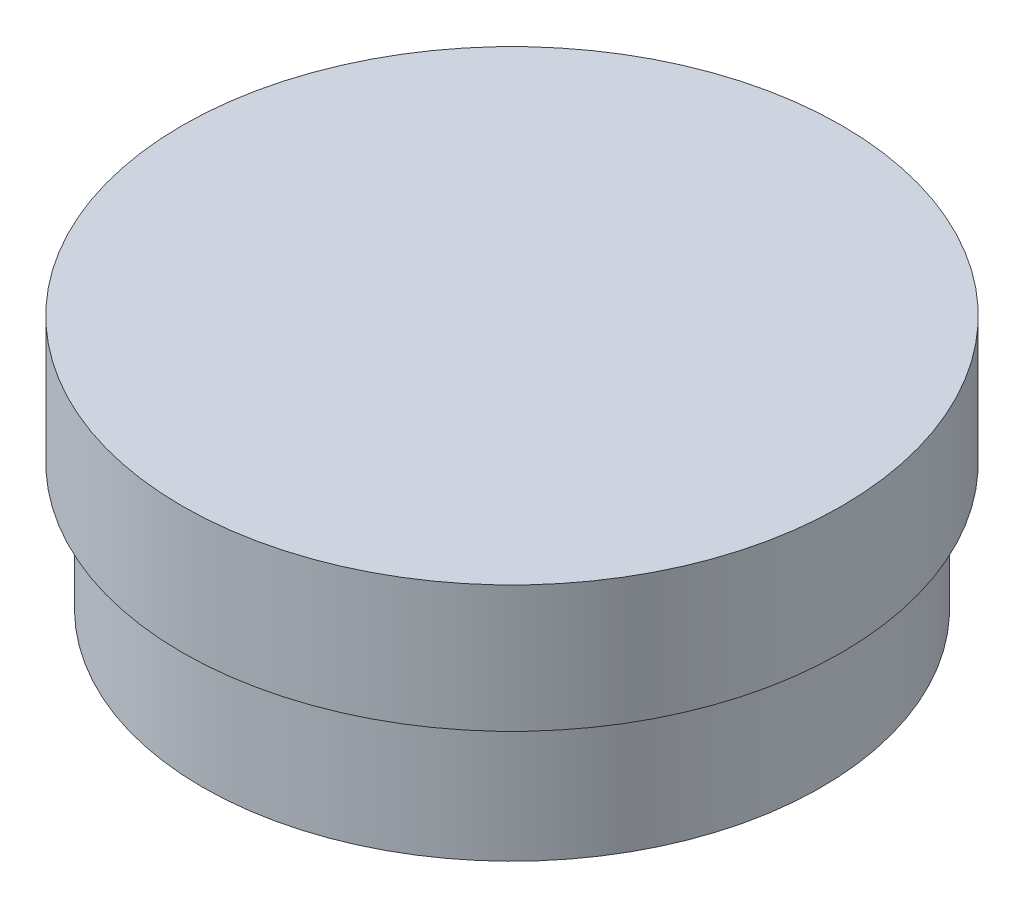
ISO-10303-21;
HEADER;
FILE_DESCRIPTION(('STEP AP214'),'2;1');
FILE_NAME('part.step','',(''),(''),'','','');
FILE_SCHEMA(('AUTOMOTIVE_DESIGN { 1 0 10303 214 1 1 1 1 }'));
ENDSEC;
DATA;
#1=APPLICATION_CONTEXT('core data for automotive mechanical design processes');
#2=APPLICATION_PROTOCOL_DEFINITION('international standard','automotive_design',2000,#1);
#3=PRODUCT_CONTEXT('',#1,'mechanical');
#4=PRODUCT('Part','Part','',(#3));
#5=PRODUCT_RELATED_PRODUCT_CATEGORY('part','',(#4));
#6=PRODUCT_DEFINITION_FORMATION('','',#4);
#7=PRODUCT_DEFINITION_CONTEXT('part definition',#1,'design');
#8=PRODUCT_DEFINITION('design','',#6,#7);
#9=PRODUCT_DEFINITION_SHAPE('','',#8);
#10=(LENGTH_UNIT() NAMED_UNIT(*) SI_UNIT(.MILLI.,.METRE.));
#11=(NAMED_UNIT(*) PLANE_ANGLE_UNIT() SI_UNIT($,.RADIAN.));
#12=(NAMED_UNIT(*) SI_UNIT($,.STERADIAN.) SOLID_ANGLE_UNIT());
#13=UNCERTAINTY_MEASURE_WITH_UNIT(LENGTH_MEASURE(1.E-05),#10,'distance_accuracy_value','');
#14=(GEOMETRIC_REPRESENTATION_CONTEXT(3) GLOBAL_UNCERTAINTY_ASSIGNED_CONTEXT((#13)) GLOBAL_UNIT_ASSIGNED_CONTEXT((#10,
#11,#12)) REPRESENTATION_CONTEXT('',''));
#15=CARTESIAN_POINT('',(0.,0.,0.));
#16=DIRECTION('',(0.,0.,1.));
#17=DIRECTION('',(1.,0.,0.));
#18=AXIS2_PLACEMENT_3D('',#15,#16,#17);
#19=CARTESIAN_POINT('',(0.,48.0535714285714,0.));
#20=DIRECTION('',(0.,-1.,0.));
#21=DIRECTION('',(0.,0.,-1.));
#22=AXIS2_PLACEMENT_3D('',#19,#20,#21);
#23=PLANE('',#22);
#24=CARTESIAN_POINT('',(0.,48.0535714285714,0.));
#25=DIRECTION('',(0.,1.,0.));
#26=DIRECTION('',(0.,0.,1.));
#27=AXIS2_PLACEMENT_3D('',#24,#25,#26);
#28=CIRCLE('',#27,65.);
#29=CARTESIAN_POINT('',(0.,48.0535714285714,65.));
#30=VERTEX_POINT('',#29);
#31=EDGE_CURVE('E10',#30,#30,#28,.T.);
#32=ORIENTED_EDGE('',*,*,#31,.T.);
#33=EDGE_LOOP('',(#32));
#34=FACE_BOUND('',#33,.T.);
#35=ADVANCED_FACE('F37',(#34),#23,.F.);
#36=CARTESIAN_POINT('',(0.,53.1607142857143,0.));
#37=DIRECTION('',(0.,1.,0.));
#38=DIRECTION('',(0.,0.,1.));
#39=AXIS2_PLACEMENT_3D('',#36,#37,#38);
#40=CYLINDRICAL_SURFACE('',#39,65.);
#41=ORIENTED_EDGE('',*,*,#31,.F.);
#42=EDGE_LOOP('',(#41));
#43=FACE_BOUND('',#42,.T.);
#44=CARTESIAN_POINT('',(0.,23.0535714285714,0.));
#45=DIRECTION('',(0.,1.,0.));
#46=DIRECTION('',(0.,0.,1.));
#47=AXIS2_PLACEMENT_3D('',#44,#45,#46);
#48=CIRCLE('',#47,65.);
#49=CARTESIAN_POINT('',(0.,23.0535714285714,65.));
#50=VERTEX_POINT('',#49);
#51=EDGE_CURVE('E44',#50,#50,#48,.T.);
#52=ORIENTED_EDGE('',*,*,#51,.T.);
#53=EDGE_LOOP('',(#52));
#54=FACE_BOUND('',#53,.T.);
#55=ADVANCED_FACE('F73',(#43,#54),#40,.T.);
#56=CARTESIAN_POINT('',(65.,23.0535714285714,0.));
#57=DIRECTION('',(0.,1.,0.));
#58=DIRECTION('',(0.,0.,1.));
#59=AXIS2_PLACEMENT_3D('',#56,#57,#58);
#60=PLANE('',#59);
#61=ORIENTED_EDGE('',*,*,#51,.F.);
#62=EDGE_LOOP('',(#61));
#63=FACE_BOUND('',#62,.T.);
#64=CARTESIAN_POINT('',(0.,23.0535714285714,0.));
#65=DIRECTION('',(0.,1.,0.));
#66=DIRECTION('',(0.,0.,1.));
#67=AXIS2_PLACEMENT_3D('',#64,#65,#66);
#68=CIRCLE('',#67,61.);
#69=CARTESIAN_POINT('',(0.,23.0535714285714,61.));
#70=VERTEX_POINT('',#69);
#71=EDGE_CURVE('E49',#70,#70,#68,.T.);
#72=ORIENTED_EDGE('',*,*,#71,.T.);
#73=EDGE_LOOP('',(#72));
#74=FACE_BOUND('',#73,.T.);
#75=ADVANCED_FACE('F69',(#63,#74),#60,.F.);
#76=CARTESIAN_POINT('',(0.,53.1607142857143,0.));
#77=DIRECTION('',(0.,1.,0.));
#78=DIRECTION('',(0.,0.,1.));
#79=AXIS2_PLACEMENT_3D('',#76,#77,#78);
#80=CYLINDRICAL_SURFACE('',#79,61.);
#81=ORIENTED_EDGE('',*,*,#71,.F.);
#82=EDGE_LOOP('',(#81));
#83=FACE_BOUND('',#82,.T.);
#84=CARTESIAN_POINT('',(0.,-1.94642857142858,0.));
#85=DIRECTION('',(0.,1.,0.));
#86=DIRECTION('',(0.,0.,1.));
#87=AXIS2_PLACEMENT_3D('',#84,#85,#86);
#88=CIRCLE('',#87,61.);
#89=CARTESIAN_POINT('',(0.,-1.94642857142858,61.));
#90=VERTEX_POINT('',#89);
#91=EDGE_CURVE('E54',#90,#90,#88,.T.);
#92=ORIENTED_EDGE('',*,*,#91,.T.);
#93=EDGE_LOOP('',(#92));
#94=FACE_BOUND('',#93,.T.);
#95=ADVANCED_FACE('F61',(#83,#94),#80,.T.);
#96=CARTESIAN_POINT('',(61.,-1.94642857142858,0.));
#97=DIRECTION('',(0.,1.,0.));
#98=DIRECTION('',(0.,0.,1.));
#99=AXIS2_PLACEMENT_3D('',#96,#97,#98);
#100=PLANE('',#99);
#101=ORIENTED_EDGE('',*,*,#91,.F.);
#102=EDGE_LOOP('',(#101));
#103=FACE_BOUND('',#102,.T.);
#104=ADVANCED_FACE('F63',(#103),#100,.F.);
#105=CLOSED_SHELL('',(#35,#55,#75,#95,#104));
#106=MANIFOLD_SOLID_BREP('B2',#105);
#107=ADVANCED_BREP_SHAPE_REPRESENTATION('',(#18,#106),#14);
#108=SHAPE_DEFINITION_REPRESENTATION(#9,#107);
ENDSEC;
END-ISO-10303-21;
